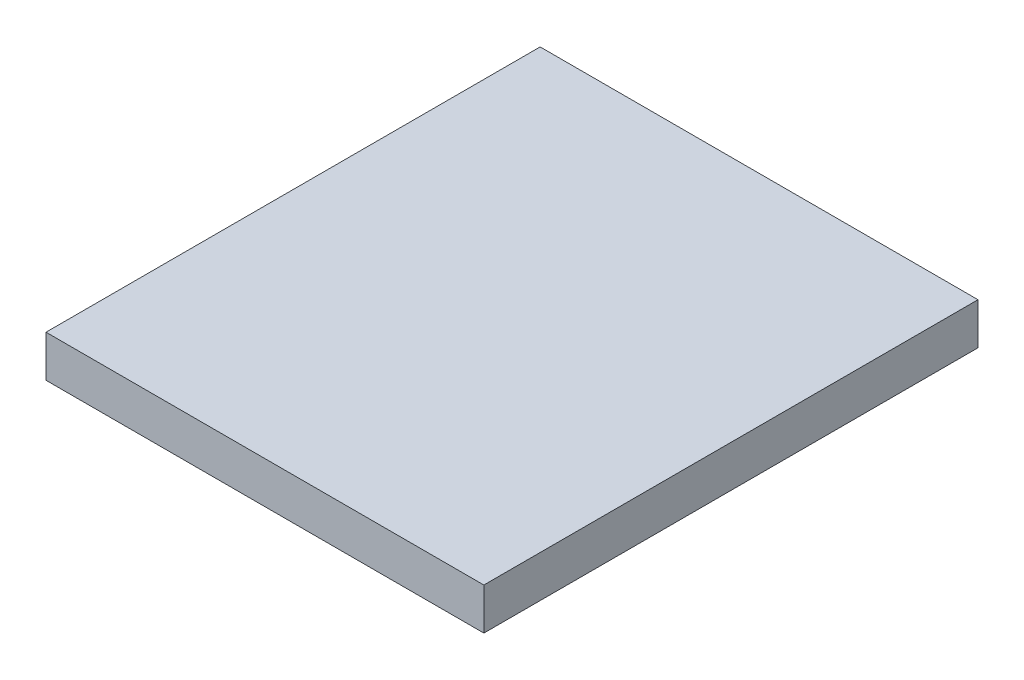
ISO-10303-21;
HEADER;
FILE_DESCRIPTION(('STEP AP214'),'2;1');
FILE_NAME('part.step','',(''),(''),'','','');
FILE_SCHEMA(('AUTOMOTIVE_DESIGN { 1 0 10303 214 1 1 1 1 }'));
ENDSEC;
DATA;
#1=APPLICATION_CONTEXT('core data for automotive mechanical design processes');
#2=APPLICATION_PROTOCOL_DEFINITION('international standard','automotive_design',2000,#1);
#3=PRODUCT_CONTEXT('',#1,'mechanical');
#4=PRODUCT('Part','Part','',(#3));
#5=PRODUCT_RELATED_PRODUCT_CATEGORY('part','',(#4));
#6=PRODUCT_DEFINITION_FORMATION('','',#4);
#7=PRODUCT_DEFINITION_CONTEXT('part definition',#1,'design');
#8=PRODUCT_DEFINITION('design','',#6,#7);
#9=PRODUCT_DEFINITION_SHAPE('','',#8);
#10=(LENGTH_UNIT() NAMED_UNIT(*) SI_UNIT(.MILLI.,.METRE.));
#11=(NAMED_UNIT(*) PLANE_ANGLE_UNIT() SI_UNIT($,.RADIAN.));
#12=(NAMED_UNIT(*) SI_UNIT($,.STERADIAN.) SOLID_ANGLE_UNIT());
#13=UNCERTAINTY_MEASURE_WITH_UNIT(LENGTH_MEASURE(1.E-05),#10,'distance_accuracy_value','');
#14=(GEOMETRIC_REPRESENTATION_CONTEXT(3) GLOBAL_UNCERTAINTY_ASSIGNED_CONTEXT((#13)) GLOBAL_UNIT_ASSIGNED_CONTEXT((#10,
#11,#12)) REPRESENTATION_CONTEXT('',''));
#15=CARTESIAN_POINT('',(0.,0.,0.));
#16=DIRECTION('',(0.,0.,1.));
#17=DIRECTION('',(1.,0.,0.));
#18=AXIS2_PLACEMENT_3D('',#15,#16,#17);
#19=CARTESIAN_POINT('',(0.,0.,0.));
#20=DIRECTION('',(0.,0.,-1.));
#21=DIRECTION('',(-1.,0.,0.));
#22=AXIS2_PLACEMENT_3D('',#19,#20,#21);
#23=PLANE('',#22);
#24=DIRECTION('',(0.,-1.,0.));
#25=VECTOR('',#24,1.);
#26=CARTESIAN_POINT('',(-100.131670194949,-14.05,0.));
#27=LINE('',#26,#25);
#28=CARTESIAN_POINT('',(-100.131670194949,4.99999999999998,0.));
#29=VERTEX_POINT('',#28);
#30=CARTESIAN_POINT('',(-100.131670194949,-14.05,0.));
#31=VERTEX_POINT('',#30);
#32=EDGE_CURVE('E83',#29,#31,#27,.T.);
#33=ORIENTED_EDGE('',*,*,#32,.F.);
#34=DIRECTION('',(-1.,0.,0.));
#35=VECTOR('',#34,1.);
#36=CARTESIAN_POINT('',(-100.131670194949,4.99999999999998,0.));
#37=LINE('',#36,#35);
#38=CARTESIAN_POINT('',(100.131670194949,4.99999999999998,0.));
#39=VERTEX_POINT('',#38);
#40=EDGE_CURVE('E94',#39,#29,#37,.T.);
#41=ORIENTED_EDGE('',*,*,#40,.F.);
#42=DIRECTION('',(0.,1.,0.));
#43=VECTOR('',#42,1.);
#44=CARTESIAN_POINT('',(100.131670194949,4.99999999999998,0.));
#45=LINE('',#44,#43);
#46=CARTESIAN_POINT('',(100.131670194949,-14.05,0.));
#47=VERTEX_POINT('',#46);
#48=EDGE_CURVE('E85',#47,#39,#45,.T.);
#49=ORIENTED_EDGE('',*,*,#48,.F.);
#50=DIRECTION('',(1.,0.,0.));
#51=VECTOR('',#50,1.);
#52=CARTESIAN_POINT('',(100.131670194949,-14.05,0.));
#53=LINE('',#52,#51);
#54=EDGE_CURVE('E75',#31,#47,#53,.T.);
#55=ORIENTED_EDGE('',*,*,#54,.F.);
#56=EDGE_LOOP('',(#33,#41,#49,#55));
#57=FACE_BOUND('',#56,.T.);
#58=ADVANCED_FACE('F33',(#57),#23,.T.);
#59=CARTESIAN_POINT('',(-100.131670194949,4.99999999999998,427.167363168382));
#60=DIRECTION('',(0.,-1.,0.));
#61=DIRECTION('',(0.,0.,-1.));
#62=AXIS2_PLACEMENT_3D('',#59,#60,#61);
#63=PLANE('',#62);
#64=DIRECTION('',(0.,0.,-1.));
#65=VECTOR('',#64,1.);
#66=CARTESIAN_POINT('',(-100.131670194949,4.99999999999998,427.167363168382));
#67=LINE('',#66,#65);
#68=CARTESIAN_POINT('',(-100.131670194949,4.99999999999998,226.));
#69=VERTEX_POINT('',#68);
#70=EDGE_CURVE('E88',#69,#29,#67,.T.);
#71=ORIENTED_EDGE('',*,*,#70,.F.);
#72=DIRECTION('',(1.,0.,0.));
#73=VECTOR('',#72,1.);
#74=CARTESIAN_POINT('',(-100.131670194949,4.99999999999998,226.));
#75=LINE('',#74,#73);
#76=CARTESIAN_POINT('',(100.131670194949,4.99999999999998,226.));
#77=VERTEX_POINT('',#76);
#78=EDGE_CURVE('E37',#69,#77,#75,.T.);
#79=ORIENTED_EDGE('',*,*,#78,.T.);
#80=DIRECTION('',(0.,0.,-1.));
#81=VECTOR('',#80,1.);
#82=CARTESIAN_POINT('',(100.131670194949,4.99999999999998,427.167363168382));
#83=LINE('',#82,#81);
#84=EDGE_CURVE('E97',#77,#39,#83,.T.);
#85=ORIENTED_EDGE('',*,*,#84,.T.);
#86=ORIENTED_EDGE('',*,*,#40,.T.);
#87=EDGE_LOOP('',(#71,#79,#85,#86));
#88=FACE_BOUND('',#87,.T.);
#89=ADVANCED_FACE('F106',(#88),#63,.F.);
#90=CARTESIAN_POINT('',(100.131670194949,4.99999999999998,427.167363168382));
#91=DIRECTION('',(-1.,0.,0.));
#92=DIRECTION('',(0.,0.,1.));
#93=AXIS2_PLACEMENT_3D('',#90,#91,#92);
#94=PLANE('',#93);
#95=ORIENTED_EDGE('',*,*,#84,.F.);
#96=DIRECTION('',(0.,-1.,0.));
#97=VECTOR('',#96,1.);
#98=CARTESIAN_POINT('',(100.131670194949,4.99999999999998,226.));
#99=LINE('',#98,#97);
#100=CARTESIAN_POINT('',(100.131670194949,-14.05,226.));
#101=VERTEX_POINT('',#100);
#102=EDGE_CURVE('E103',#77,#101,#99,.T.);
#103=ORIENTED_EDGE('',*,*,#102,.T.);
#104=DIRECTION('',(0.,0.,-1.));
#105=VECTOR('',#104,1.);
#106=CARTESIAN_POINT('',(100.131670194949,-14.05,427.167363168382));
#107=LINE('',#106,#105);
#108=EDGE_CURVE('E79',#101,#47,#107,.T.);
#109=ORIENTED_EDGE('',*,*,#108,.T.);
#110=ORIENTED_EDGE('',*,*,#48,.T.);
#111=EDGE_LOOP('',(#95,#103,#109,#110));
#112=FACE_BOUND('',#111,.T.);
#113=ADVANCED_FACE('F102',(#112),#94,.F.);
#114=CARTESIAN_POINT('',(100.131670194949,-14.05,427.167363168382));
#115=DIRECTION('',(0.,1.,0.));
#116=DIRECTION('',(0.,0.,1.));
#117=AXIS2_PLACEMENT_3D('',#114,#115,#116);
#118=PLANE('',#117);
#119=ORIENTED_EDGE('',*,*,#108,.F.);
#120=DIRECTION('',(-1.,0.,0.));
#121=VECTOR('',#120,1.);
#122=CARTESIAN_POINT('',(100.131670194949,-14.05,226.));
#123=LINE('',#122,#121);
#124=CARTESIAN_POINT('',(-100.131670194949,-14.05,226.));
#125=VERTEX_POINT('',#124);
#126=EDGE_CURVE('E42',#101,#125,#123,.T.);
#127=ORIENTED_EDGE('',*,*,#126,.T.);
#128=DIRECTION('',(0.,0.,-1.));
#129=VECTOR('',#128,1.);
#130=CARTESIAN_POINT('',(-100.131670194949,-14.05,427.167363168382));
#131=LINE('',#130,#129);
#132=EDGE_CURVE('E72',#125,#31,#131,.T.);
#133=ORIENTED_EDGE('',*,*,#132,.T.);
#134=ORIENTED_EDGE('',*,*,#54,.T.);
#135=EDGE_LOOP('',(#119,#127,#133,#134));
#136=FACE_BOUND('',#135,.T.);
#137=ADVANCED_FACE('F74',(#136),#118,.F.);
#138=CARTESIAN_POINT('',(-100.131670194949,-14.05,427.167363168382));
#139=DIRECTION('',(1.,0.,0.));
#140=DIRECTION('',(0.,0.,-1.));
#141=AXIS2_PLACEMENT_3D('',#138,#139,#140);
#142=PLANE('',#141);
#143=ORIENTED_EDGE('',*,*,#132,.F.);
#144=DIRECTION('',(0.,1.,0.));
#145=VECTOR('',#144,1.);
#146=CARTESIAN_POINT('',(-100.131670194949,-14.05,226.));
#147=LINE('',#146,#145);
#148=EDGE_CURVE('E11',#125,#69,#147,.T.);
#149=ORIENTED_EDGE('',*,*,#148,.T.);
#150=ORIENTED_EDGE('',*,*,#70,.T.);
#151=ORIENTED_EDGE('',*,*,#32,.T.);
#152=EDGE_LOOP('',(#143,#149,#150,#151));
#153=FACE_BOUND('',#152,.T.);
#154=ADVANCED_FACE('F35',(#153),#142,.F.);
#155=CARTESIAN_POINT('',(0.,0.,226.));
#156=DIRECTION('',(0.,0.,-1.));
#157=DIRECTION('',(-1.,0.,0.));
#158=AXIS2_PLACEMENT_3D('',#155,#156,#157);
#159=PLANE('',#158);
#160=ORIENTED_EDGE('',*,*,#126,.F.);
#161=ORIENTED_EDGE('',*,*,#102,.F.);
#162=ORIENTED_EDGE('',*,*,#78,.F.);
#163=ORIENTED_EDGE('',*,*,#148,.F.);
#164=EDGE_LOOP('',(#160,#161,#162,#163));
#165=FACE_BOUND('',#164,.T.);
#166=ADVANCED_FACE('F120',(#165),#159,.F.);
#167=CLOSED_SHELL('',(#58,#89,#113,#137,#154,#166));
#168=MANIFOLD_SOLID_BREP('B2',#167);
#169=ADVANCED_BREP_SHAPE_REPRESENTATION('',(#18,#168),#14);
#170=SHAPE_DEFINITION_REPRESENTATION(#9,#169);
ENDSEC;
END-ISO-10303-21;
